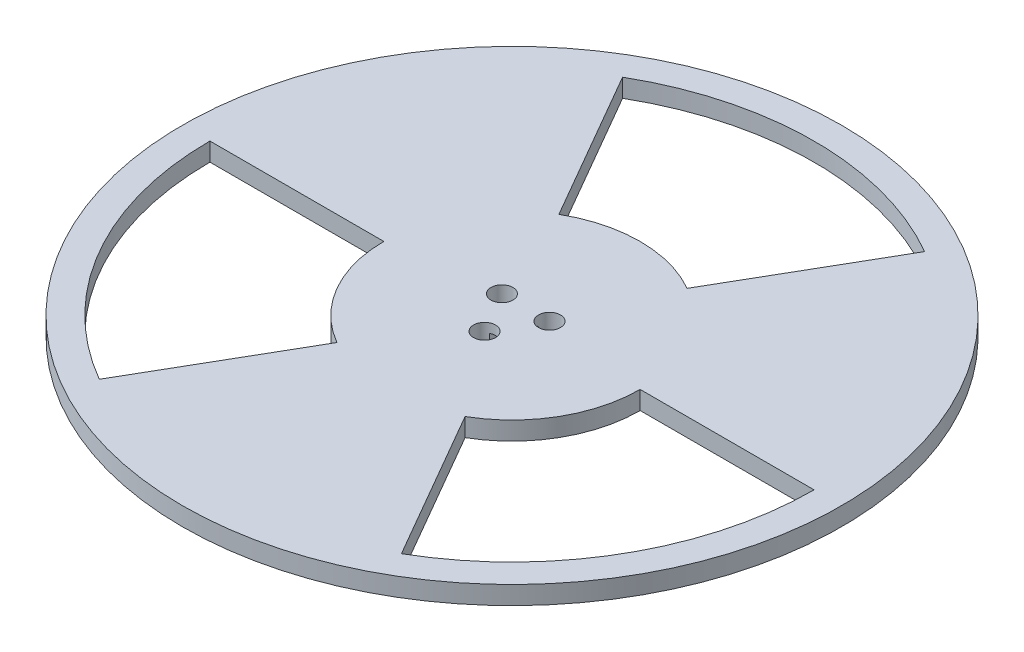
ISO-10303-21;
HEADER;
FILE_DESCRIPTION(('STEP AP214'),'2;1');
FILE_NAME('part.step','',(''),(''),'','','');
FILE_SCHEMA(('AUTOMOTIVE_DESIGN { 1 0 10303 214 1 1 1 1 }'));
ENDSEC;
DATA;
#1=APPLICATION_CONTEXT('core data for automotive mechanical design processes');
#2=APPLICATION_PROTOCOL_DEFINITION('international standard','automotive_design',2000,#1);
#3=PRODUCT_CONTEXT('',#1,'mechanical');
#4=PRODUCT('Part','Part','',(#3));
#5=PRODUCT_RELATED_PRODUCT_CATEGORY('part','',(#4));
#6=PRODUCT_DEFINITION_FORMATION('','',#4);
#7=PRODUCT_DEFINITION_CONTEXT('part definition',#1,'design');
#8=PRODUCT_DEFINITION('design','',#6,#7);
#9=PRODUCT_DEFINITION_SHAPE('','',#8);
#10=(LENGTH_UNIT() NAMED_UNIT(*) SI_UNIT(.MILLI.,.METRE.));
#11=(NAMED_UNIT(*) PLANE_ANGLE_UNIT() SI_UNIT($,.RADIAN.));
#12=(NAMED_UNIT(*) SI_UNIT($,.STERADIAN.) SOLID_ANGLE_UNIT());
#13=UNCERTAINTY_MEASURE_WITH_UNIT(LENGTH_MEASURE(1.E-05),#10,'distance_accuracy_value','');
#14=(GEOMETRIC_REPRESENTATION_CONTEXT(3) GLOBAL_UNCERTAINTY_ASSIGNED_CONTEXT((#13)) GLOBAL_UNIT_ASSIGNED_CONTEXT((#10,
#11,#12)) REPRESENTATION_CONTEXT('',''));
#15=CARTESIAN_POINT('',(0.,0.,0.));
#16=DIRECTION('',(0.,0.,1.));
#17=DIRECTION('',(1.,0.,0.));
#18=AXIS2_PLACEMENT_3D('',#15,#16,#17);
#19=CARTESIAN_POINT('',(0.,1.,0.));
#20=DIRECTION('',(0.,-1.,0.));
#21=DIRECTION('',(0.,0.,-1.));
#22=AXIS2_PLACEMENT_3D('',#19,#20,#21);
#23=CYLINDRICAL_SURFACE('',#22,18.);
#24=CARTESIAN_POINT('',(0.,1.,0.));
#25=DIRECTION('',(0.,1.,0.));
#26=DIRECTION('',(0.,0.,1.));
#27=AXIS2_PLACEMENT_3D('',#24,#25,#26);
#28=CIRCLE('',#27,18.);
#29=CARTESIAN_POINT('',(0.,1.,18.));
#30=VERTEX_POINT('',#29);
#31=EDGE_CURVE('E351',#30,#30,#28,.T.);
#32=ORIENTED_EDGE('',*,*,#31,.F.);
#33=EDGE_LOOP('',(#32));
#34=FACE_BOUND('',#33,.T.);
#35=CARTESIAN_POINT('',(0.,0.,0.));
#36=DIRECTION('',(0.,1.,0.));
#37=DIRECTION('',(0.,0.,1.));
#38=AXIS2_PLACEMENT_3D('',#35,#36,#37);
#39=CIRCLE('',#38,18.);
#40=CARTESIAN_POINT('',(0.,0.,18.));
#41=VERTEX_POINT('',#40);
#42=EDGE_CURVE('E350',#41,#41,#39,.T.);
#43=ORIENTED_EDGE('',*,*,#42,.T.);
#44=EDGE_LOOP('',(#43));
#45=FACE_BOUND('',#44,.T.);
#46=ADVANCED_FACE('F39',(#34,#45),#23,.T.);
#47=CARTESIAN_POINT('',(0.,1.,0.));
#48=DIRECTION('',(0.,1.,0.));
#49=DIRECTION('',(0.,0.,1.));
#50=AXIS2_PLACEMENT_3D('',#47,#48,#49);
#51=PLANE('',#50);
#52=CARTESIAN_POINT('',(0.,1.,0.));
#53=DIRECTION('',(0.,1.,0.));
#54=DIRECTION('',(0.,0.,-1.));
#55=AXIS2_PLACEMENT_3D('',#52,#53,#54);
#56=CIRCLE('',#55,16.5);
#57=CARTESIAN_POINT('',(8.25000000000002,1.,-14.2894191624432));
#58=VERTEX_POINT('',#57);
#59=CARTESIAN_POINT('',(-8.25000000000002,1.,-14.2894191624432));
#60=VERTEX_POINT('',#59);
#61=EDGE_CURVE('E55',#58,#60,#56,.T.);
#62=ORIENTED_EDGE('',*,*,#61,.F.);
#63=DIRECTION('',(0.500000000000001,0.,-0.866025403784438));
#64=VECTOR('',#63,1.);
#65=CARTESIAN_POINT('',(3.50000000000001,1.,-6.06217782649107));
#66=LINE('',#65,#64);
#67=CARTESIAN_POINT('',(3.50000000000001,1.,-6.06217782649107));
#68=VERTEX_POINT('',#67);
#69=EDGE_CURVE('E190',#68,#58,#66,.T.);
#70=ORIENTED_EDGE('',*,*,#69,.F.);
#71=CARTESIAN_POINT('',(0.,1.,0.));
#72=DIRECTION('',(0.,-1.,0.));
#73=DIRECTION('',(0.,0.,-1.));
#74=AXIS2_PLACEMENT_3D('',#71,#72,#73);
#75=CIRCLE('',#74,7.);
#76=CARTESIAN_POINT('',(-3.50000000000001,1.,-6.06217782649107));
#77=VERTEX_POINT('',#76);
#78=EDGE_CURVE('E171',#77,#68,#75,.T.);
#79=ORIENTED_EDGE('',*,*,#78,.F.);
#80=DIRECTION('',(0.500000000000001,0.,0.866025403784438));
#81=VECTOR('',#80,1.);
#82=CARTESIAN_POINT('',(-3.50000000000001,1.,-6.06217782649107));
#83=LINE('',#82,#81);
#84=EDGE_CURVE('E182',#60,#77,#83,.T.);
#85=ORIENTED_EDGE('',*,*,#84,.F.);
#86=EDGE_LOOP('',(#62,#70,#79,#85));
#87=FACE_BOUND('',#86,.T.);
#88=CARTESIAN_POINT('',(-1.29903810567667,1.,-0.75));
#89=DIRECTION('',(0.,1.,0.));
#90=DIRECTION('',(0.,0.,1.));
#91=AXIS2_PLACEMENT_3D('',#88,#89,#90);
#92=CIRCLE('',#91,0.6);
#93=CARTESIAN_POINT('',(-1.29903810567667,1.,-0.15));
#94=VERTEX_POINT('',#93);
#95=EDGE_CURVE('E209',#94,#94,#92,.T.);
#96=ORIENTED_EDGE('',*,*,#95,.F.);
#97=EDGE_LOOP('',(#96));
#98=FACE_BOUND('',#97,.T.);
#99=CARTESIAN_POINT('',(0.,1.,0.));
#100=DIRECTION('',(0.,1.,0.));
#101=DIRECTION('',(0.,0.,-1.));
#102=AXIS2_PLACEMENT_3D('',#99,#100,#101);
#103=CIRCLE('',#102,16.5);
#104=CARTESIAN_POINT('',(8.24999999999991,1.,14.2894191624433));
#105=VERTEX_POINT('',#104);
#106=CARTESIAN_POINT('',(16.5,1.,0.));
#107=VERTEX_POINT('',#106);
#108=EDGE_CURVE('E63',#105,#107,#103,.T.);
#109=ORIENTED_EDGE('',*,*,#108,.F.);
#110=DIRECTION('',(0.499999999999995,0.,0.866025403784442));
#111=VECTOR('',#110,1.);
#112=CARTESIAN_POINT('',(3.49999999999996,1.,6.06217782649109));
#113=LINE('',#112,#111);
#114=CARTESIAN_POINT('',(3.49999999999996,1.,6.06217782649109));
#115=VERTEX_POINT('',#114);
#116=EDGE_CURVE('E257',#115,#105,#113,.T.);
#117=ORIENTED_EDGE('',*,*,#116,.F.);
#118=CARTESIAN_POINT('',(0.,1.,0.));
#119=DIRECTION('',(0.,-1.,0.));
#120=DIRECTION('',(0.,0.,-1.));
#121=AXIS2_PLACEMENT_3D('',#118,#119,#120);
#122=CIRCLE('',#121,7.);
#123=CARTESIAN_POINT('',(7.,1.,0.));
#124=VERTEX_POINT('',#123);
#125=EDGE_CURVE('E253',#124,#115,#122,.T.);
#126=ORIENTED_EDGE('',*,*,#125,.F.);
#127=DIRECTION('',(-1.,0.,0.));
#128=VECTOR('',#127,1.);
#129=CARTESIAN_POINT('',(7.,1.,0.));
#130=LINE('',#129,#128);
#131=EDGE_CURVE('E248',#107,#124,#130,.T.);
#132=ORIENTED_EDGE('',*,*,#131,.F.);
#133=EDGE_LOOP('',(#109,#117,#126,#132));
#134=FACE_BOUND('',#133,.T.);
#135=CARTESIAN_POINT('',(0.,1.,0.));
#136=DIRECTION('',(0.,1.,0.));
#137=DIRECTION('',(0.,0.,-1.));
#138=AXIS2_PLACEMENT_3D('',#135,#136,#137);
#139=CIRCLE('',#138,16.5);
#140=CARTESIAN_POINT('',(-16.5,1.,-1.72604985859692E-13));
#141=VERTEX_POINT('',#140);
#142=CARTESIAN_POINT('',(-8.25000000000011,1.,14.2894191624432));
#143=VERTEX_POINT('',#142);
#144=EDGE_CURVE('E227',#141,#143,#139,.T.);
#145=ORIENTED_EDGE('',*,*,#144,.F.);
#146=DIRECTION('',(-1.,0.,0.));
#147=VECTOR('',#146,1.);
#148=CARTESIAN_POINT('',(-7.,1.,0.));
#149=LINE('',#148,#147);
#150=CARTESIAN_POINT('',(-7.,1.,0.));
#151=VERTEX_POINT('',#150);
#152=EDGE_CURVE('E295',#151,#141,#149,.T.);
#153=ORIENTED_EDGE('',*,*,#152,.F.);
#154=CARTESIAN_POINT('',(0.,1.,0.));
#155=DIRECTION('',(0.,-1.,0.));
#156=DIRECTION('',(0.,0.,-1.));
#157=AXIS2_PLACEMENT_3D('',#154,#155,#156);
#158=CIRCLE('',#157,7.);
#159=CARTESIAN_POINT('',(-3.50000000000005,1.,6.06217782649104));
#160=VERTEX_POINT('',#159);
#161=EDGE_CURVE('E291',#160,#151,#158,.T.);
#162=ORIENTED_EDGE('',*,*,#161,.F.);
#163=DIRECTION('',(0.500000000000007,0.,-0.866025403784435));
#164=VECTOR('',#163,1.);
#165=CARTESIAN_POINT('',(-3.50000000000005,1.,6.06217782649104));
#166=LINE('',#165,#164);
#167=EDGE_CURVE('E287',#143,#160,#166,.T.);
#168=ORIENTED_EDGE('',*,*,#167,.F.);
#169=EDGE_LOOP('',(#145,#153,#162,#168));
#170=FACE_BOUND('',#169,.T.);
#171=CARTESIAN_POINT('',(1.29903810567665,1.,-0.750000000000006));
#172=DIRECTION('',(0.,1.,0.));
#173=DIRECTION('',(0.,0.,1.));
#174=AXIS2_PLACEMENT_3D('',#171,#172,#173);
#175=CIRCLE('',#174,0.6);
#176=CARTESIAN_POINT('',(1.29903810567665,1.,-0.150000000000007));
#177=VERTEX_POINT('',#176);
#178=EDGE_CURVE('E218',#177,#177,#175,.T.);
#179=ORIENTED_EDGE('',*,*,#178,.F.);
#180=EDGE_LOOP('',(#179));
#181=FACE_BOUND('',#180,.T.);
#182=CARTESIAN_POINT('',(0.,1.,1.5));
#183=DIRECTION('',(0.,1.,0.));
#184=DIRECTION('',(0.,0.,1.));
#185=AXIS2_PLACEMENT_3D('',#182,#183,#184);
#186=CIRCLE('',#185,0.6);
#187=CARTESIAN_POINT('',(0.,1.,2.1));
#188=VERTEX_POINT('',#187);
#189=EDGE_CURVE('E217',#188,#188,#186,.T.);
#190=ORIENTED_EDGE('',*,*,#189,.F.);
#191=EDGE_LOOP('',(#190));
#192=FACE_BOUND('',#191,.T.);
#193=ORIENTED_EDGE('',*,*,#31,.T.);
#194=EDGE_LOOP('',(#193));
#195=FACE_BOUND('',#194,.T.);
#196=ADVANCED_FACE('F187',(#87,#98,#134,#170,#181,#192,#195),#51,.T.);
#197=CARTESIAN_POINT('',(0.,0.,0.));
#198=DIRECTION('',(0.,1.,0.));
#199=DIRECTION('',(0.,0.,1.));
#200=AXIS2_PLACEMENT_3D('',#197,#198,#199);
#201=PLANE('',#200);
#202=DIRECTION('',(-0.500000000000001,0.,0.866025403784438));
#203=VECTOR('',#202,1.);
#204=CARTESIAN_POINT('',(3.50000000000001,0.,-6.06217782649107));
#205=LINE('',#204,#203);
#206=CARTESIAN_POINT('',(8.25000000000002,0.,-14.2894191624432));
#207=VERTEX_POINT('',#206);
#208=CARTESIAN_POINT('',(3.50000000000001,0.,-6.06217782649107));
#209=VERTEX_POINT('',#208);
#210=EDGE_CURVE('E588',#207,#209,#205,.T.);
#211=ORIENTED_EDGE('',*,*,#210,.F.);
#212=CARTESIAN_POINT('',(0.,0.,0.));
#213=DIRECTION('',(0.,1.,0.));
#214=DIRECTION('',(0.,0.,1.));
#215=AXIS2_PLACEMENT_3D('',#212,#213,#214);
#216=CIRCLE('',#215,16.5);
#217=CARTESIAN_POINT('',(-8.25000000000002,0.,-14.2894191624432));
#218=VERTEX_POINT('',#217);
#219=EDGE_CURVE('E208',#218,#207,#216,.F.);
#220=ORIENTED_EDGE('',*,*,#219,.F.);
#221=DIRECTION('',(-0.500000000000001,0.,-0.866025403784438));
#222=VECTOR('',#221,1.);
#223=CARTESIAN_POINT('',(-3.50000000000001,0.,-6.06217782649107));
#224=LINE('',#223,#222);
#225=CARTESIAN_POINT('',(-3.50000000000001,0.,-6.06217782649107));
#226=VERTEX_POINT('',#225);
#227=EDGE_CURVE('E204',#226,#218,#224,.T.);
#228=ORIENTED_EDGE('',*,*,#227,.F.);
#229=CARTESIAN_POINT('',(0.,0.,0.));
#230=DIRECTION('',(0.,1.,0.));
#231=DIRECTION('',(0.,0.,1.));
#232=AXIS2_PLACEMENT_3D('',#229,#230,#231);
#233=CIRCLE('',#232,7.);
#234=EDGE_CURVE('E174',#209,#226,#233,.T.);
#235=ORIENTED_EDGE('',*,*,#234,.F.);
#236=EDGE_LOOP('',(#211,#220,#228,#235));
#237=FACE_BOUND('',#236,.T.);
#238=DIRECTION('',(-0.499999999999995,0.,-0.866025403784442));
#239=VECTOR('',#238,1.);
#240=CARTESIAN_POINT('',(3.49999999999996,0.,6.06217782649109));
#241=LINE('',#240,#239);
#242=CARTESIAN_POINT('',(8.24999999999991,0.,14.2894191624433));
#243=VERTEX_POINT('',#242);
#244=CARTESIAN_POINT('',(3.49999999999996,0.,6.06217782649109));
#245=VERTEX_POINT('',#244);
#246=EDGE_CURVE('E238',#243,#245,#241,.T.);
#247=ORIENTED_EDGE('',*,*,#246,.F.);
#248=CARTESIAN_POINT('',(0.,0.,0.));
#249=DIRECTION('',(0.,1.,0.));
#250=DIRECTION('',(0.,0.,1.));
#251=AXIS2_PLACEMENT_3D('',#248,#249,#250);
#252=CIRCLE('',#251,16.5);
#253=CARTESIAN_POINT('',(16.5,0.,0.));
#254=VERTEX_POINT('',#253);
#255=EDGE_CURVE('E242',#254,#243,#252,.F.);
#256=ORIENTED_EDGE('',*,*,#255,.F.);
#257=DIRECTION('',(1.,0.,0.));
#258=VECTOR('',#257,1.);
#259=CARTESIAN_POINT('',(7.,0.,0.));
#260=LINE('',#259,#258);
#261=CARTESIAN_POINT('',(7.,0.,0.));
#262=VERTEX_POINT('',#261);
#263=EDGE_CURVE('E245',#262,#254,#260,.T.);
#264=ORIENTED_EDGE('',*,*,#263,.F.);
#265=CARTESIAN_POINT('',(0.,0.,0.));
#266=DIRECTION('',(0.,1.,0.));
#267=DIRECTION('',(0.,0.,1.));
#268=AXIS2_PLACEMENT_3D('',#265,#266,#267);
#269=CIRCLE('',#268,7.);
#270=EDGE_CURVE('E234',#245,#262,#269,.T.);
#271=ORIENTED_EDGE('',*,*,#270,.F.);
#272=EDGE_LOOP('',(#247,#256,#264,#271));
#273=FACE_BOUND('',#272,.T.);
#274=DIRECTION('',(1.,0.,0.));
#275=VECTOR('',#274,1.);
#276=CARTESIAN_POINT('',(-7.,0.,0.));
#277=LINE('',#276,#275);
#278=CARTESIAN_POINT('',(-16.5,0.,-1.72604985859692E-13));
#279=VERTEX_POINT('',#278);
#280=CARTESIAN_POINT('',(-7.,0.,0.));
#281=VERTEX_POINT('',#280);
#282=EDGE_CURVE('E278',#279,#281,#277,.T.);
#283=ORIENTED_EDGE('',*,*,#282,.F.);
#284=CARTESIAN_POINT('',(0.,0.,0.));
#285=DIRECTION('',(0.,1.,0.));
#286=DIRECTION('',(0.,0.,1.));
#287=AXIS2_PLACEMENT_3D('',#284,#285,#286);
#288=CIRCLE('',#287,16.5);
#289=CARTESIAN_POINT('',(-8.25000000000011,0.,14.2894191624432));
#290=VERTEX_POINT('',#289);
#291=EDGE_CURVE('E282',#290,#279,#288,.F.);
#292=ORIENTED_EDGE('',*,*,#291,.F.);
#293=DIRECTION('',(-0.500000000000007,0.,0.866025403784435));
#294=VECTOR('',#293,1.);
#295=CARTESIAN_POINT('',(-3.50000000000005,0.,6.06217782649104));
#296=LINE('',#295,#294);
#297=CARTESIAN_POINT('',(-3.50000000000005,0.,6.06217782649104));
#298=VERTEX_POINT('',#297);
#299=EDGE_CURVE('E249',#298,#290,#296,.T.);
#300=ORIENTED_EDGE('',*,*,#299,.F.);
#301=CARTESIAN_POINT('',(0.,0.,0.));
#302=DIRECTION('',(0.,1.,0.));
#303=DIRECTION('',(0.,0.,1.));
#304=AXIS2_PLACEMENT_3D('',#301,#302,#303);
#305=CIRCLE('',#304,7.);
#306=EDGE_CURVE('E274',#281,#298,#305,.T.);
#307=ORIENTED_EDGE('',*,*,#306,.F.);
#308=EDGE_LOOP('',(#283,#292,#300,#307));
#309=FACE_BOUND('',#308,.T.);
#310=CARTESIAN_POINT('',(0.,0.,0.));
#311=DIRECTION('',(0.,1.,0.));
#312=DIRECTION('',(0.,0.,1.));
#313=AXIS2_PLACEMENT_3D('',#310,#311,#312);
#314=CIRCLE('',#313,3.);
#315=CARTESIAN_POINT('',(0.,0.,3.));
#316=VERTEX_POINT('',#315);
#317=EDGE_CURVE('E362',#316,#316,#314,.T.);
#318=ORIENTED_EDGE('',*,*,#317,.T.);
#319=EDGE_LOOP('',(#318));
#320=FACE_BOUND('',#319,.T.);
#321=ORIENTED_EDGE('',*,*,#42,.F.);
#322=EDGE_LOOP('',(#321));
#323=FACE_BOUND('',#322,.T.);
#324=ADVANCED_FACE('F423',(#237,#273,#309,#320,#323),#201,.F.);
#325=CARTESIAN_POINT('',(0.,-2.,0.));
#326=DIRECTION('',(0.,1.,0.));
#327=DIRECTION('',(0.,0.,1.));
#328=AXIS2_PLACEMENT_3D('',#325,#326,#327);
#329=CYLINDRICAL_SURFACE('',#328,2.);
#330=CARTESIAN_POINT('',(0.,-1.,0.));
#331=DIRECTION('',(0.,1.,0.));
#332=DIRECTION('',(0.,0.,1.));
#333=AXIS2_PLACEMENT_3D('',#330,#331,#332);
#334=CIRCLE('',#333,2.);
#335=CARTESIAN_POINT('',(0.,-1.,2.));
#336=VERTEX_POINT('',#335);
#337=EDGE_CURVE('E355',#336,#336,#334,.F.);
#338=ORIENTED_EDGE('',*,*,#337,.T.);
#339=EDGE_LOOP('',(#338));
#340=FACE_BOUND('',#339,.T.);
#341=CARTESIAN_POINT('',(0.,-2.,0.));
#342=DIRECTION('',(0.,-1.,0.));
#343=DIRECTION('',(0.,0.,-1.));
#344=AXIS2_PLACEMENT_3D('',#341,#342,#343);
#345=CIRCLE('',#344,2.);
#346=CARTESIAN_POINT('',(0.,-2.,-2.));
#347=VERTEX_POINT('',#346);
#348=EDGE_CURVE('E346',#347,#347,#345,.T.);
#349=ORIENTED_EDGE('',*,*,#348,.F.);
#350=EDGE_LOOP('',(#349));
#351=FACE_BOUND('',#350,.T.);
#352=ADVANCED_FACE('F429',(#340,#351),#329,.T.);
#353=CARTESIAN_POINT('',(0.,-2.,0.));
#354=DIRECTION('',(0.,-1.,0.));
#355=DIRECTION('',(0.,0.,-1.));
#356=AXIS2_PLACEMENT_3D('',#353,#354,#355);
#357=PLANE('',#356);
#358=CARTESIAN_POINT('',(0.,-2.,0.));
#359=DIRECTION('',(0.,-1.,0.));
#360=DIRECTION('',(0.,0.,-1.));
#361=AXIS2_PLACEMENT_3D('',#358,#359,#360);
#362=CIRCLE('',#361,1.);
#363=CARTESIAN_POINT('',(0.,-2.,-1.));
#364=VERTEX_POINT('',#363);
#365=EDGE_CURVE('E336',#364,#364,#362,.T.);
#366=ORIENTED_EDGE('',*,*,#365,.F.);
#367=EDGE_LOOP('',(#366));
#368=FACE_BOUND('',#367,.T.);
#369=ORIENTED_EDGE('',*,*,#348,.T.);
#370=EDGE_LOOP('',(#369));
#371=FACE_BOUND('',#370,.T.);
#372=ADVANCED_FACE('F434',(#368,#371),#357,.T.);
#373=CARTESIAN_POINT('',(0.,0.5,0.));
#374=DIRECTION('',(0.,-1.,0.));
#375=DIRECTION('',(0.,0.,-1.));
#376=AXIS2_PLACEMENT_3D('',#373,#374,#375);
#377=CYLINDRICAL_SURFACE('',#376,1.);
#378=CARTESIAN_POINT('',(0.,0.5,0.));
#379=DIRECTION('',(0.,-1.,0.));
#380=DIRECTION('',(0.,0.,-1.));
#381=AXIS2_PLACEMENT_3D('',#378,#379,#380);
#382=CIRCLE('',#381,1.);
#383=CARTESIAN_POINT('',(-0.700117412895012,0.5,-0.714027736268834));
#384=VERTEX_POINT('',#383);
#385=CARTESIAN_POINT('',(0.700117412895002,0.5,-0.714027736268844));
#386=VERTEX_POINT('',#385);
#387=EDGE_CURVE('E337',#384,#386,#382,.T.);
#388=ORIENTED_EDGE('',*,*,#387,.F.);
#389=DIRECTION('',(0.,1.,0.));
#390=VECTOR('',#389,1.);
#391=CARTESIAN_POINT('',(-0.700117412895012,0.5,-0.714027736268834));
#392=LINE('',#391,#390);
#393=CARTESIAN_POINT('',(-0.700117412895012,0.,-0.714027736268834));
#394=VERTEX_POINT('',#393);
#395=EDGE_CURVE('E332',#384,#394,#392,.F.);
#396=ORIENTED_EDGE('',*,*,#395,.T.);
#397=CARTESIAN_POINT('',(0.,0.,0.));
#398=DIRECTION('',(0.,1.,0.));
#399=DIRECTION('',(0.,0.,1.));
#400=AXIS2_PLACEMENT_3D('',#397,#398,#399);
#401=CIRCLE('',#400,1.);
#402=CARTESIAN_POINT('',(-0.968424865063013,0.,-0.249305597064498));
#403=VERTEX_POINT('',#402);
#404=EDGE_CURVE('E11',#403,#394,#401,.F.);
#405=ORIENTED_EDGE('',*,*,#404,.F.);
#406=DIRECTION('',(0.,1.,0.));
#407=VECTOR('',#406,1.);
#408=CARTESIAN_POINT('',(-0.968424865063013,0.5,-0.249305597064498));
#409=LINE('',#408,#407);
#410=CARTESIAN_POINT('',(-0.968424865063013,0.5,-0.249305597064498));
#411=VERTEX_POINT('',#410);
#412=EDGE_CURVE('E328',#403,#411,#409,.T.);
#413=ORIENTED_EDGE('',*,*,#412,.T.);
#414=CARTESIAN_POINT('',(-0.268307452168009,0.5,0.963333333333333));
#415=VERTEX_POINT('',#414);
#416=EDGE_CURVE('E341',#415,#411,#382,.T.);
#417=ORIENTED_EDGE('',*,*,#416,.F.);
#418=DIRECTION('',(0.,1.,0.));
#419=VECTOR('',#418,1.);
#420=CARTESIAN_POINT('',(-0.26830745216801,0.5,0.963333333333333));
#421=LINE('',#420,#419);
#422=CARTESIAN_POINT('',(-0.26830745216801,0.,0.963333333333333));
#423=VERTEX_POINT('',#422);
#424=EDGE_CURVE('E316',#415,#423,#421,.F.);
#425=ORIENTED_EDGE('',*,*,#424,.T.);
#426=CARTESIAN_POINT('',(0.,0.,0.));
#427=DIRECTION('',(0.,1.,0.));
#428=DIRECTION('',(0.,0.,1.));
#429=AXIS2_PLACEMENT_3D('',#426,#427,#428);
#430=CIRCLE('',#429,1.);
#431=CARTESIAN_POINT('',(0.26830745216801,0.,0.963333333333333));
#432=VERTEX_POINT('',#431);
#433=EDGE_CURVE('E375',#432,#423,#430,.F.);
#434=ORIENTED_EDGE('',*,*,#433,.F.);
#435=DIRECTION('',(0.,1.,0.));
#436=VECTOR('',#435,1.);
#437=CARTESIAN_POINT('',(0.26830745216801,0.5,0.963333333333333));
#438=LINE('',#437,#436);
#439=CARTESIAN_POINT('',(0.268307452168009,0.5,0.963333333333333));
#440=VERTEX_POINT('',#439);
#441=EDGE_CURVE('E207',#432,#440,#438,.T.);
#442=ORIENTED_EDGE('',*,*,#441,.T.);
#443=CARTESIAN_POINT('',(0.968424865063013,0.5,-0.249305597064498));
#444=VERTEX_POINT('',#443);
#445=EDGE_CURVE('E342',#444,#440,#382,.T.);
#446=ORIENTED_EDGE('',*,*,#445,.F.);
#447=DIRECTION('',(0.,1.,0.));
#448=VECTOR('',#447,1.);
#449=CARTESIAN_POINT('',(0.968424865063012,0.5,-0.249305597064497));
#450=LINE('',#449,#448);
#451=CARTESIAN_POINT('',(0.968424865063013,0.,-0.249305597064497));
#452=VERTEX_POINT('',#451);
#453=EDGE_CURVE('E324',#444,#452,#450,.F.);
#454=ORIENTED_EDGE('',*,*,#453,.T.);
#455=CARTESIAN_POINT('',(0.,0.,0.));
#456=DIRECTION('',(0.,1.,0.));
#457=DIRECTION('',(0.,0.,1.));
#458=AXIS2_PLACEMENT_3D('',#455,#456,#457);
#459=CIRCLE('',#458,1.);
#460=CARTESIAN_POINT('',(0.700117412895002,0.,-0.714027736268844));
#461=VERTEX_POINT('',#460);
#462=EDGE_CURVE('E48',#461,#452,#459,.F.);
#463=ORIENTED_EDGE('',*,*,#462,.F.);
#464=DIRECTION('',(0.,1.,0.));
#465=VECTOR('',#464,1.);
#466=CARTESIAN_POINT('',(0.700117412895002,0.5,-0.714027736268844));
#467=LINE('',#466,#465);
#468=EDGE_CURVE('E320',#461,#386,#467,.T.);
#469=ORIENTED_EDGE('',*,*,#468,.T.);
#470=EDGE_LOOP('',(#388,#396,#405,#413,#417,#425,#434,#442,#446,#454,#463,#469));
#471=FACE_BOUND('',#470,.T.);
#472=ORIENTED_EDGE('',*,*,#365,.T.);
#473=EDGE_LOOP('',(#472));
#474=FACE_BOUND('',#473,.T.);
#475=ADVANCED_FACE('F388',(#471,#474),#377,.F.);
#476=CARTESIAN_POINT('',(0.,0.5,0.));
#477=DIRECTION('',(0.,-1.,0.));
#478=DIRECTION('',(0.,0.,-1.));
#479=AXIS2_PLACEMENT_3D('',#476,#477,#478);
#480=PLANE('',#479);
#481=CARTESIAN_POINT('',(-1.29903810567667,0.5,-0.75));
#482=DIRECTION('',(0.,-1.,0.));
#483=DIRECTION('',(0.,0.,-1.));
#484=AXIS2_PLACEMENT_3D('',#481,#482,#483);
#485=CIRCLE('',#484,0.6);
#486=EDGE_CURVE('E372',#384,#411,#485,.T.);
#487=ORIENTED_EDGE('',*,*,#486,.F.);
#488=ORIENTED_EDGE('',*,*,#387,.T.);
#489=CARTESIAN_POINT('',(1.29903810567665,0.5,-0.750000000000006));
#490=DIRECTION('',(0.,-1.,0.));
#491=DIRECTION('',(0.,0.,-1.));
#492=AXIS2_PLACEMENT_3D('',#489,#490,#491);
#493=CIRCLE('',#492,0.6);
#494=EDGE_CURVE('E369',#444,#386,#493,.T.);
#495=ORIENTED_EDGE('',*,*,#494,.F.);
#496=ORIENTED_EDGE('',*,*,#445,.T.);
#497=CARTESIAN_POINT('',(0.,0.5,1.5));
#498=DIRECTION('',(0.,-1.,0.));
#499=DIRECTION('',(0.,0.,-1.));
#500=AXIS2_PLACEMENT_3D('',#497,#498,#499);
#501=CIRCLE('',#500,0.6);
#502=EDGE_CURVE('E366',#415,#440,#501,.T.);
#503=ORIENTED_EDGE('',*,*,#502,.F.);
#504=ORIENTED_EDGE('',*,*,#416,.T.);
#505=EDGE_LOOP('',(#487,#488,#495,#496,#503,#504));
#506=FACE_BOUND('',#505,.T.);
#507=ADVANCED_FACE('F399',(#506),#480,.T.);
#508=CARTESIAN_POINT('',(0.,-1.,0.));
#509=DIRECTION('',(0.,1.,0.));
#510=DIRECTION('',(0.,0.,1.));
#511=AXIS2_PLACEMENT_3D('',#508,#509,#510);
#512=TOROIDAL_SURFACE('',#511,3.,1.);
#513=ORIENTED_EDGE('',*,*,#317,.F.);
#514=EDGE_LOOP('',(#513));
#515=FACE_BOUND('',#514,.T.);
#516=ORIENTED_EDGE('',*,*,#337,.F.);
#517=EDGE_LOOP('',(#516));
#518=FACE_BOUND('',#517,.T.);
#519=ADVANCED_FACE('F41',(#515,#518),#512,.F.);
#520=CARTESIAN_POINT('',(0.,0.,0.));
#521=DIRECTION('',(0.,1.,0.));
#522=DIRECTION('',(0.,0.,1.));
#523=AXIS2_PLACEMENT_3D('',#520,#521,#522);
#524=PLANE('',#523);
#525=ORIENTED_EDGE('',*,*,#433,.T.);
#526=CARTESIAN_POINT('',(0.,0.,1.5));
#527=DIRECTION('',(0.,1.,0.));
#528=DIRECTION('',(0.,0.,1.));
#529=AXIS2_PLACEMENT_3D('',#526,#527,#528);
#530=CIRCLE('',#529,0.6);
#531=EDGE_CURVE('E223',#432,#423,#530,.F.);
#532=ORIENTED_EDGE('',*,*,#531,.F.);
#533=EDGE_LOOP('',(#525,#532));
#534=FACE_BOUND('',#533,.T.);
#535=ADVANCED_FACE('F477',(#534),#524,.T.);
#536=CARTESIAN_POINT('',(0.,-19.5242959341892,1.5));
#537=DIRECTION('',(0.,1.,0.));
#538=DIRECTION('',(0.,0.,1.));
#539=AXIS2_PLACEMENT_3D('',#536,#537,#538);
#540=CYLINDRICAL_SURFACE('',#539,0.6);
#541=ORIENTED_EDGE('',*,*,#189,.T.);
#542=EDGE_LOOP('',(#541));
#543=FACE_BOUND('',#542,.T.);
#544=ORIENTED_EDGE('',*,*,#502,.T.);
#545=ORIENTED_EDGE('',*,*,#441,.F.);
#546=ORIENTED_EDGE('',*,*,#531,.T.);
#547=ORIENTED_EDGE('',*,*,#424,.F.);
#548=EDGE_LOOP('',(#544,#545,#546,#547));
#549=FACE_BOUND('',#548,.T.);
#550=ADVANCED_FACE('F474',(#543,#549),#540,.F.);
#551=CARTESIAN_POINT('',(0.,0.,0.));
#552=DIRECTION('',(0.,1.,0.));
#553=DIRECTION('',(0.,0.,1.));
#554=AXIS2_PLACEMENT_3D('',#551,#552,#553);
#555=PLANE('',#554);
#556=ORIENTED_EDGE('',*,*,#462,.T.);
#557=CARTESIAN_POINT('',(1.29903810567665,0.,-0.750000000000006));
#558=DIRECTION('',(0.,1.,0.));
#559=DIRECTION('',(0.,0.,1.));
#560=AXIS2_PLACEMENT_3D('',#557,#558,#559);
#561=CIRCLE('',#560,0.6);
#562=EDGE_CURVE('E222',#461,#452,#561,.F.);
#563=ORIENTED_EDGE('',*,*,#562,.F.);
#564=EDGE_LOOP('',(#556,#563));
#565=FACE_BOUND('',#564,.T.);
#566=ADVANCED_FACE('F381',(#565),#555,.T.);
#567=CARTESIAN_POINT('',(1.29903810567665,-19.5242959341892,-0.750000000000006));
#568=DIRECTION('',(0.,1.,0.));
#569=DIRECTION('',(0.,0.,1.));
#570=AXIS2_PLACEMENT_3D('',#567,#568,#569);
#571=CYLINDRICAL_SURFACE('',#570,0.6);
#572=ORIENTED_EDGE('',*,*,#178,.T.);
#573=EDGE_LOOP('',(#572));
#574=FACE_BOUND('',#573,.T.);
#575=ORIENTED_EDGE('',*,*,#494,.T.);
#576=ORIENTED_EDGE('',*,*,#468,.F.);
#577=ORIENTED_EDGE('',*,*,#562,.T.);
#578=ORIENTED_EDGE('',*,*,#453,.F.);
#579=EDGE_LOOP('',(#575,#576,#577,#578));
#580=FACE_BOUND('',#579,.T.);
#581=ADVANCED_FACE('F384',(#574,#580),#571,.F.);
#582=CARTESIAN_POINT('',(0.,0.,0.));
#583=DIRECTION('',(0.,1.,0.));
#584=DIRECTION('',(0.,0.,1.));
#585=AXIS2_PLACEMENT_3D('',#582,#583,#584);
#586=PLANE('',#585);
#587=ORIENTED_EDGE('',*,*,#404,.T.);
#588=CARTESIAN_POINT('',(-1.29903810567667,0.,-0.75));
#589=DIRECTION('',(0.,1.,0.));
#590=DIRECTION('',(0.,0.,1.));
#591=AXIS2_PLACEMENT_3D('',#588,#589,#590);
#592=CIRCLE('',#591,0.6);
#593=EDGE_CURVE('E213',#403,#394,#592,.F.);
#594=ORIENTED_EDGE('',*,*,#593,.F.);
#595=EDGE_LOOP('',(#587,#594));
#596=FACE_BOUND('',#595,.T.);
#597=ADVANCED_FACE('F405',(#596),#586,.T.);
#598=CARTESIAN_POINT('',(-1.29903810567667,-19.5242959341892,-0.75));
#599=DIRECTION('',(0.,1.,0.));
#600=DIRECTION('',(0.,0.,1.));
#601=AXIS2_PLACEMENT_3D('',#598,#599,#600);
#602=CYLINDRICAL_SURFACE('',#601,0.6);
#603=ORIENTED_EDGE('',*,*,#95,.T.);
#604=EDGE_LOOP('',(#603));
#605=FACE_BOUND('',#604,.T.);
#606=ORIENTED_EDGE('',*,*,#486,.T.);
#607=ORIENTED_EDGE('',*,*,#412,.F.);
#608=ORIENTED_EDGE('',*,*,#593,.T.);
#609=ORIENTED_EDGE('',*,*,#395,.F.);
#610=EDGE_LOOP('',(#606,#607,#608,#609));
#611=FACE_BOUND('',#610,.T.);
#612=ADVANCED_FACE('F403',(#605,#611),#602,.F.);
#613=CARTESIAN_POINT('',(0.,-19.5242959341892,0.));
#614=DIRECTION('',(0.,1.,0.));
#615=DIRECTION('',(0.,0.,1.));
#616=AXIS2_PLACEMENT_3D('',#613,#614,#615);
#617=CYLINDRICAL_SURFACE('',#616,16.5);
#618=ORIENTED_EDGE('',*,*,#291,.T.);
#619=DIRECTION('',(0.,1.,0.));
#620=VECTOR('',#619,1.);
#621=CARTESIAN_POINT('',(-16.5,-19.5242959341892,-1.72604985859692E-13));
#622=LINE('',#621,#620);
#623=EDGE_CURVE('E279',#279,#141,#622,.T.);
#624=ORIENTED_EDGE('',*,*,#623,.T.);
#625=ORIENTED_EDGE('',*,*,#144,.T.);
#626=DIRECTION('',(0.,1.,0.));
#627=VECTOR('',#626,1.);
#628=CARTESIAN_POINT('',(-8.25000000000011,-19.5242959341892,14.2894191624432));
#629=LINE('',#628,#627);
#630=EDGE_CURVE('E299',#290,#143,#629,.T.);
#631=ORIENTED_EDGE('',*,*,#630,.F.);
#632=EDGE_LOOP('',(#618,#624,#625,#631));
#633=FACE_BOUND('',#632,.T.);
#634=ADVANCED_FACE('F412',(#633),#617,.F.);
#635=CARTESIAN_POINT('',(-7.,-19.5242959341892,0.));
#636=DIRECTION('',(0.,0.,-1.));
#637=DIRECTION('',(-1.,0.,0.));
#638=AXIS2_PLACEMENT_3D('',#635,#636,#637);
#639=PLANE('',#638);
#640=ORIENTED_EDGE('',*,*,#282,.T.);
#641=DIRECTION('',(0.,1.,0.));
#642=VECTOR('',#641,1.);
#643=CARTESIAN_POINT('',(-7.,-19.5242959341892,0.));
#644=LINE('',#643,#642);
#645=EDGE_CURVE('E302',#281,#151,#644,.T.);
#646=ORIENTED_EDGE('',*,*,#645,.T.);
#647=ORIENTED_EDGE('',*,*,#152,.T.);
#648=ORIENTED_EDGE('',*,*,#623,.F.);
#649=EDGE_LOOP('',(#640,#646,#647,#648));
#650=FACE_BOUND('',#649,.T.);
#651=ADVANCED_FACE('F445',(#650),#639,.F.);
#652=CARTESIAN_POINT('',(0.,-19.5242959341892,0.));
#653=DIRECTION('',(0.,1.,0.));
#654=DIRECTION('',(0.,0.,1.));
#655=AXIS2_PLACEMENT_3D('',#652,#653,#654);
#656=CYLINDRICAL_SURFACE('',#655,7.);
#657=ORIENTED_EDGE('',*,*,#306,.T.);
#658=DIRECTION('',(0.,1.,0.));
#659=VECTOR('',#658,1.);
#660=CARTESIAN_POINT('',(-3.50000000000005,-19.5242959341892,6.06217782649104));
#661=LINE('',#660,#659);
#662=EDGE_CURVE('E305',#298,#160,#661,.T.);
#663=ORIENTED_EDGE('',*,*,#662,.T.);
#664=ORIENTED_EDGE('',*,*,#161,.T.);
#665=ORIENTED_EDGE('',*,*,#645,.F.);
#666=EDGE_LOOP('',(#657,#663,#664,#665));
#667=FACE_BOUND('',#666,.T.);
#668=ADVANCED_FACE('F451',(#667),#656,.T.);
#669=CARTESIAN_POINT('',(-3.50000000000005,-19.5242959341892,6.06217782649104));
#670=DIRECTION('',(0.866025403784435,0.,0.500000000000007));
#671=DIRECTION('',(0.500000000000007,0.,-0.866025403784435));
#672=AXIS2_PLACEMENT_3D('',#669,#670,#671);
#673=PLANE('',#672);
#674=ORIENTED_EDGE('',*,*,#299,.T.);
#675=ORIENTED_EDGE('',*,*,#630,.T.);
#676=ORIENTED_EDGE('',*,*,#167,.T.);
#677=ORIENTED_EDGE('',*,*,#662,.F.);
#678=EDGE_LOOP('',(#674,#675,#676,#677));
#679=FACE_BOUND('',#678,.T.);
#680=ADVANCED_FACE('F447',(#679),#673,.F.);
#681=CARTESIAN_POINT('',(0.,-19.5242959341892,0.));
#682=DIRECTION('',(0.,1.,0.));
#683=DIRECTION('',(0.,0.,1.));
#684=AXIS2_PLACEMENT_3D('',#681,#682,#683);
#685=CYLINDRICAL_SURFACE('',#684,16.5);
#686=ORIENTED_EDGE('',*,*,#255,.T.);
#687=DIRECTION('',(0.,1.,0.));
#688=VECTOR('',#687,1.);
#689=CARTESIAN_POINT('',(8.24999999999991,-19.5242959341892,14.2894191624433));
#690=LINE('',#689,#688);
#691=EDGE_CURVE('E239',#243,#105,#690,.T.);
#692=ORIENTED_EDGE('',*,*,#691,.T.);
#693=ORIENTED_EDGE('',*,*,#108,.T.);
#694=DIRECTION('',(0.,1.,0.));
#695=VECTOR('',#694,1.);
#696=CARTESIAN_POINT('',(16.5,-19.5242959341892,0.));
#697=LINE('',#696,#695);
#698=EDGE_CURVE('E261',#254,#107,#697,.T.);
#699=ORIENTED_EDGE('',*,*,#698,.F.);
#700=EDGE_LOOP('',(#686,#692,#693,#699));
#701=FACE_BOUND('',#700,.T.);
#702=ADVANCED_FACE('F450',(#701),#685,.F.);
#703=CARTESIAN_POINT('',(3.49999999999996,-19.5242959341892,6.06217782649109));
#704=DIRECTION('',(-0.866025403784442,0.,0.499999999999995));
#705=DIRECTION('',(0.499999999999995,0.,0.866025403784442));
#706=AXIS2_PLACEMENT_3D('',#703,#704,#705);
#707=PLANE('',#706);
#708=ORIENTED_EDGE('',*,*,#246,.T.);
#709=DIRECTION('',(0.,1.,0.));
#710=VECTOR('',#709,1.);
#711=CARTESIAN_POINT('',(3.49999999999996,-19.5242959341892,6.06217782649109));
#712=LINE('',#711,#710);
#713=EDGE_CURVE('E264',#245,#115,#712,.T.);
#714=ORIENTED_EDGE('',*,*,#713,.T.);
#715=ORIENTED_EDGE('',*,*,#116,.T.);
#716=ORIENTED_EDGE('',*,*,#691,.F.);
#717=EDGE_LOOP('',(#708,#714,#715,#716));
#718=FACE_BOUND('',#717,.T.);
#719=ADVANCED_FACE('F461',(#718),#707,.F.);
#720=CARTESIAN_POINT('',(0.,-19.5242959341892,0.));
#721=DIRECTION('',(0.,1.,0.));
#722=DIRECTION('',(0.,0.,1.));
#723=AXIS2_PLACEMENT_3D('',#720,#721,#722);
#724=CYLINDRICAL_SURFACE('',#723,7.);
#725=ORIENTED_EDGE('',*,*,#270,.T.);
#726=DIRECTION('',(0.,1.,0.));
#727=VECTOR('',#726,1.);
#728=CARTESIAN_POINT('',(7.,-19.5242959341892,0.));
#729=LINE('',#728,#727);
#730=EDGE_CURVE('E267',#262,#124,#729,.T.);
#731=ORIENTED_EDGE('',*,*,#730,.T.);
#732=ORIENTED_EDGE('',*,*,#125,.T.);
#733=ORIENTED_EDGE('',*,*,#713,.F.);
#734=EDGE_LOOP('',(#725,#731,#732,#733));
#735=FACE_BOUND('',#734,.T.);
#736=ADVANCED_FACE('F466',(#735),#724,.T.);
#737=CARTESIAN_POINT('',(7.,-19.5242959341892,0.));
#738=DIRECTION('',(0.,0.,-1.));
#739=DIRECTION('',(-1.,0.,0.));
#740=AXIS2_PLACEMENT_3D('',#737,#738,#739);
#741=PLANE('',#740);
#742=ORIENTED_EDGE('',*,*,#263,.T.);
#743=ORIENTED_EDGE('',*,*,#698,.T.);
#744=ORIENTED_EDGE('',*,*,#131,.T.);
#745=ORIENTED_EDGE('',*,*,#730,.F.);
#746=EDGE_LOOP('',(#742,#743,#744,#745));
#747=FACE_BOUND('',#746,.T.);
#748=ADVANCED_FACE('F462',(#747),#741,.F.);
#749=CARTESIAN_POINT('',(0.,-19.5242959341892,0.));
#750=DIRECTION('',(0.,1.,0.));
#751=DIRECTION('',(0.,0.,1.));
#752=AXIS2_PLACEMENT_3D('',#749,#750,#751);
#753=CYLINDRICAL_SURFACE('',#752,16.5);
#754=ORIENTED_EDGE('',*,*,#219,.T.);
#755=DIRECTION('',(0.,1.,0.));
#756=VECTOR('',#755,1.);
#757=CARTESIAN_POINT('',(8.25000000000002,-19.5242959341892,-14.2894191624432));
#758=LINE('',#757,#756);
#759=EDGE_CURVE('E197',#207,#58,#758,.T.);
#760=ORIENTED_EDGE('',*,*,#759,.T.);
#761=ORIENTED_EDGE('',*,*,#61,.T.);
#762=DIRECTION('',(0.,1.,0.));
#763=VECTOR('',#762,1.);
#764=CARTESIAN_POINT('',(-8.25000000000002,-19.5242959341892,-14.2894191624432));
#765=LINE('',#764,#763);
#766=EDGE_CURVE('E179',#218,#60,#765,.T.);
#767=ORIENTED_EDGE('',*,*,#766,.F.);
#768=EDGE_LOOP('',(#754,#760,#761,#767));
#769=FACE_BOUND('',#768,.T.);
#770=ADVANCED_FACE('F465',(#769),#753,.F.);
#771=CARTESIAN_POINT('',(3.50000000000001,-19.5242959341892,-6.06217782649107));
#772=DIRECTION('',(0.866025403784438,0.,0.500000000000001));
#773=DIRECTION('',(0.500000000000001,0.,-0.866025403784438));
#774=AXIS2_PLACEMENT_3D('',#771,#772,#773);
#775=PLANE('',#774);
#776=ORIENTED_EDGE('',*,*,#210,.T.);
#777=DIRECTION('',(0.,1.,0.));
#778=VECTOR('',#777,1.);
#779=CARTESIAN_POINT('',(3.50000000000001,-19.5242959341892,-6.06217782649107));
#780=LINE('',#779,#778);
#781=EDGE_CURVE('E178',#209,#68,#780,.T.);
#782=ORIENTED_EDGE('',*,*,#781,.T.);
#783=ORIENTED_EDGE('',*,*,#69,.T.);
#784=ORIENTED_EDGE('',*,*,#759,.F.);
#785=EDGE_LOOP('',(#776,#782,#783,#784));
#786=FACE_BOUND('',#785,.T.);
#787=ADVANCED_FACE('F558',(#786),#775,.F.);
#788=CARTESIAN_POINT('',(0.,-19.5242959341892,0.));
#789=DIRECTION('',(0.,1.,0.));
#790=DIRECTION('',(0.,0.,1.));
#791=AXIS2_PLACEMENT_3D('',#788,#789,#790);
#792=CYLINDRICAL_SURFACE('',#791,7.);
#793=ORIENTED_EDGE('',*,*,#234,.T.);
#794=DIRECTION('',(0.,1.,0.));
#795=VECTOR('',#794,1.);
#796=CARTESIAN_POINT('',(-3.50000000000001,-19.5242959341892,-6.06217782649107));
#797=LINE('',#796,#795);
#798=EDGE_CURVE('E166',#226,#77,#797,.T.);
#799=ORIENTED_EDGE('',*,*,#798,.T.);
#800=ORIENTED_EDGE('',*,*,#78,.T.);
#801=ORIENTED_EDGE('',*,*,#781,.F.);
#802=EDGE_LOOP('',(#793,#799,#800,#801));
#803=FACE_BOUND('',#802,.T.);
#804=ADVANCED_FACE('F168',(#803),#792,.T.);
#805=CARTESIAN_POINT('',(-3.50000000000001,-19.5242959341892,-6.06217782649107));
#806=DIRECTION('',(-0.866025403784438,0.,0.500000000000001));
#807=DIRECTION('',(0.500000000000001,0.,0.866025403784438));
#808=AXIS2_PLACEMENT_3D('',#805,#806,#807);
#809=PLANE('',#808);
#810=ORIENTED_EDGE('',*,*,#227,.T.);
#811=ORIENTED_EDGE('',*,*,#766,.T.);
#812=ORIENTED_EDGE('',*,*,#84,.T.);
#813=ORIENTED_EDGE('',*,*,#798,.F.);
#814=EDGE_LOOP('',(#810,#811,#812,#813));
#815=FACE_BOUND('',#814,.T.);
#816=ADVANCED_FACE('F183',(#815),#809,.F.);
#817=CLOSED_SHELL('',(#46,#196,#324,#352,#372,#475,#507,#519,#535,#550,#566,#581,#597,#612,#634,
#651,#668,#680,#702,#719,#736,#748,#770,#787,#804,#816));
#818=MANIFOLD_SOLID_BREP('B2',#817);
#819=ADVANCED_BREP_SHAPE_REPRESENTATION('',(#18,#818),#14);
#820=SHAPE_DEFINITION_REPRESENTATION(#9,#819);
ENDSEC;
END-ISO-10303-21;
